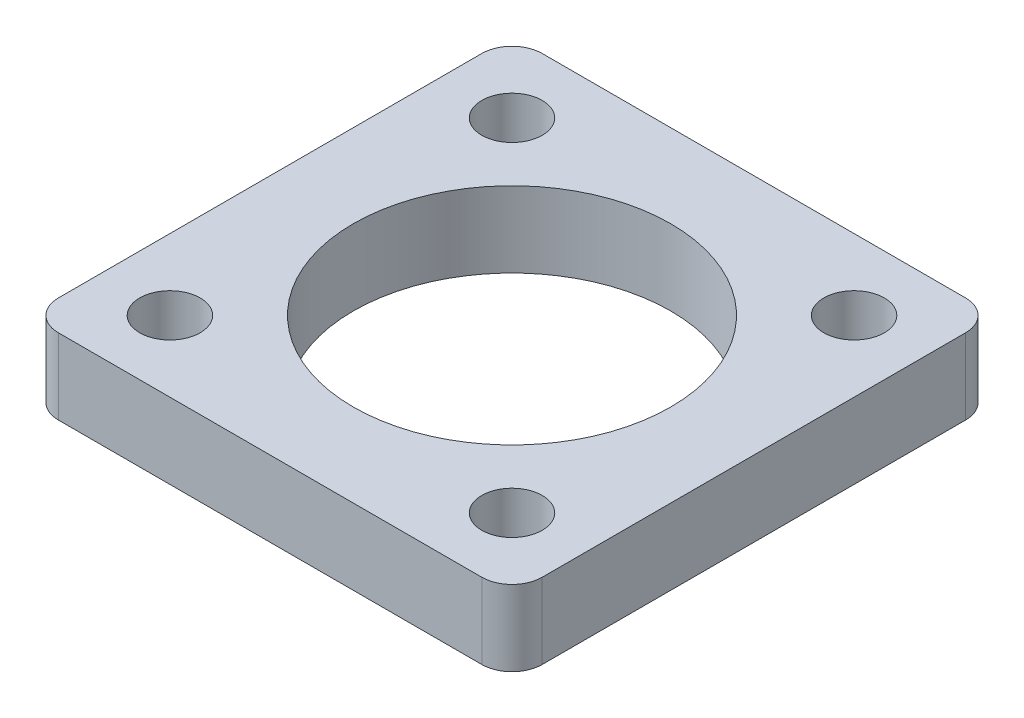
ISO-10303-21;
HEADER;
FILE_DESCRIPTION(('STEP AP214'),'2;1');
FILE_NAME('part.step','',(''),(''),'','','');
FILE_SCHEMA(('AUTOMOTIVE_DESIGN { 1 0 10303 214 1 1 1 1 }'));
ENDSEC;
DATA;
#1=APPLICATION_CONTEXT('core data for automotive mechanical design processes');
#2=APPLICATION_PROTOCOL_DEFINITION('international standard','automotive_design',2000,#1);
#3=PRODUCT_CONTEXT('',#1,'mechanical');
#4=PRODUCT('Part','Part','',(#3));
#5=PRODUCT_RELATED_PRODUCT_CATEGORY('part','',(#4));
#6=PRODUCT_DEFINITION_FORMATION('','',#4);
#7=PRODUCT_DEFINITION_CONTEXT('part definition',#1,'design');
#8=PRODUCT_DEFINITION('design','',#6,#7);
#9=PRODUCT_DEFINITION_SHAPE('','',#8);
#10=(LENGTH_UNIT() NAMED_UNIT(*) SI_UNIT(.MILLI.,.METRE.));
#11=(NAMED_UNIT(*) PLANE_ANGLE_UNIT() SI_UNIT($,.RADIAN.));
#12=(NAMED_UNIT(*) SI_UNIT($,.STERADIAN.) SOLID_ANGLE_UNIT());
#13=UNCERTAINTY_MEASURE_WITH_UNIT(LENGTH_MEASURE(1.E-05),#10,'distance_accuracy_value','');
#14=(GEOMETRIC_REPRESENTATION_CONTEXT(3) GLOBAL_UNCERTAINTY_ASSIGNED_CONTEXT((#13)) GLOBAL_UNIT_ASSIGNED_CONTEXT((#10,
#11,#12)) REPRESENTATION_CONTEXT('',''));
#15=CARTESIAN_POINT('',(0.,0.,0.));
#16=DIRECTION('',(0.,0.,1.));
#17=DIRECTION('',(1.,0.,0.));
#18=AXIS2_PLACEMENT_3D('',#15,#16,#17);
#19=CARTESIAN_POINT('',(0.,5.,0.));
#20=DIRECTION('',(0.,1.,0.));
#21=DIRECTION('',(0.,0.,1.));
#22=AXIS2_PLACEMENT_3D('',#19,#20,#21);
#23=PLANE('',#22);
#24=CARTESIAN_POINT('',(11.3137084989848,5.,11.3137084989848));
#25=DIRECTION('',(0.,1.,0.));
#26=DIRECTION('',(0.,0.,1.));
#27=AXIS2_PLACEMENT_3D('',#24,#25,#26);
#28=CIRCLE('',#27,2.);
#29=CARTESIAN_POINT('',(11.3137084989848,5.,13.3137084989848));
#30=VERTEX_POINT('',#29);
#31=EDGE_CURVE('E195',#30,#30,#28,.T.);
#32=ORIENTED_EDGE('',*,*,#31,.F.);
#33=EDGE_LOOP('',(#32));
#34=FACE_BOUND('',#33,.T.);
#35=CARTESIAN_POINT('',(0.,5.,0.));
#36=DIRECTION('',(0.,1.,0.));
#37=DIRECTION('',(0.,0.,1.));
#38=AXIS2_PLACEMENT_3D('',#35,#36,#37);
#39=CIRCLE('',#38,10.5);
#40=CARTESIAN_POINT('',(0.,5.,10.5));
#41=VERTEX_POINT('',#40);
#42=EDGE_CURVE('E184',#41,#41,#39,.T.);
#43=ORIENTED_EDGE('',*,*,#42,.F.);
#44=EDGE_LOOP('',(#43));
#45=FACE_BOUND('',#44,.T.);
#46=DIRECTION('',(1.,0.,0.));
#47=VECTOR('',#46,1.);
#48=CARTESIAN_POINT('',(-16.,5.,16.));
#49=LINE('',#48,#47);
#50=CARTESIAN_POINT('',(-14.,5.,16.));
#51=VERTEX_POINT('',#50);
#52=CARTESIAN_POINT('',(14.,5.,16.));
#53=VERTEX_POINT('',#52);
#54=EDGE_CURVE('E140',#51,#53,#49,.T.);
#55=ORIENTED_EDGE('',*,*,#54,.T.);
#56=CARTESIAN_POINT('',(14.,5.,14.));
#57=DIRECTION('',(0.,1.,0.));
#58=DIRECTION('',(0.,0.,1.));
#59=AXIS2_PLACEMENT_3D('',#56,#57,#58);
#60=CIRCLE('',#59,2.);
#61=CARTESIAN_POINT('',(16.,5.,14.));
#62=VERTEX_POINT('',#61);
#63=EDGE_CURVE('E158',#53,#62,#60,.T.);
#64=ORIENTED_EDGE('',*,*,#63,.T.);
#65=DIRECTION('',(0.,0.,-1.));
#66=VECTOR('',#65,1.);
#67=CARTESIAN_POINT('',(16.,5.,-16.));
#68=LINE('',#67,#66);
#69=CARTESIAN_POINT('',(16.,5.,-14.));
#70=VERTEX_POINT('',#69);
#71=EDGE_CURVE('E122',#62,#70,#68,.T.);
#72=ORIENTED_EDGE('',*,*,#71,.T.);
#73=CARTESIAN_POINT('',(14.,5.,-14.));
#74=DIRECTION('',(0.,1.,0.));
#75=DIRECTION('',(0.,0.,1.));
#76=AXIS2_PLACEMENT_3D('',#73,#74,#75);
#77=CIRCLE('',#76,2.);
#78=CARTESIAN_POINT('',(14.,5.,-16.));
#79=VERTEX_POINT('',#78);
#80=EDGE_CURVE('E155',#70,#79,#77,.T.);
#81=ORIENTED_EDGE('',*,*,#80,.T.);
#82=DIRECTION('',(-1.,0.,0.));
#83=VECTOR('',#82,1.);
#84=CARTESIAN_POINT('',(-16.,5.,-16.));
#85=LINE('',#84,#83);
#86=CARTESIAN_POINT('',(-14.,5.,-16.));
#87=VERTEX_POINT('',#86);
#88=EDGE_CURVE('E169',#79,#87,#85,.T.);
#89=ORIENTED_EDGE('',*,*,#88,.T.);
#90=CARTESIAN_POINT('',(-14.,5.,-14.));
#91=DIRECTION('',(0.,1.,0.));
#92=DIRECTION('',(0.,0.,1.));
#93=AXIS2_PLACEMENT_3D('',#90,#91,#92);
#94=CIRCLE('',#93,2.);
#95=CARTESIAN_POINT('',(-16.,5.,-14.));
#96=VERTEX_POINT('',#95);
#97=EDGE_CURVE('E58',#87,#96,#94,.T.);
#98=ORIENTED_EDGE('',*,*,#97,.T.);
#99=DIRECTION('',(0.,0.,1.));
#100=VECTOR('',#99,1.);
#101=CARTESIAN_POINT('',(-16.,5.,-16.));
#102=LINE('',#101,#100);
#103=CARTESIAN_POINT('',(-16.,5.,14.));
#104=VERTEX_POINT('',#103);
#105=EDGE_CURVE('E177',#96,#104,#102,.T.);
#106=ORIENTED_EDGE('',*,*,#105,.T.);
#107=CARTESIAN_POINT('',(-14.,5.,14.));
#108=DIRECTION('',(0.,1.,0.));
#109=DIRECTION('',(0.,0.,1.));
#110=AXIS2_PLACEMENT_3D('',#107,#108,#109);
#111=CIRCLE('',#110,2.);
#112=EDGE_CURVE('E153',#104,#51,#111,.T.);
#113=ORIENTED_EDGE('',*,*,#112,.T.);
#114=EDGE_LOOP('',(#55,#64,#72,#81,#89,#98,#106,#113));
#115=FACE_BOUND('',#114,.T.);
#116=CARTESIAN_POINT('',(-11.3137084989848,5.,-11.3137084989848));
#117=DIRECTION('',(0.,1.,0.));
#118=DIRECTION('',(0.,0.,1.));
#119=AXIS2_PLACEMENT_3D('',#116,#117,#118);
#120=CIRCLE('',#119,2.);
#121=CARTESIAN_POINT('',(-11.3137084989848,5.,-9.31370849898476));
#122=VERTEX_POINT('',#121);
#123=EDGE_CURVE('E131',#122,#122,#120,.T.);
#124=ORIENTED_EDGE('',*,*,#123,.F.);
#125=EDGE_LOOP('',(#124));
#126=FACE_BOUND('',#125,.T.);
#127=CARTESIAN_POINT('',(11.3137084989848,5.,-11.3137084989848));
#128=DIRECTION('',(0.,1.,0.));
#129=DIRECTION('',(0.,0.,1.));
#130=AXIS2_PLACEMENT_3D('',#127,#128,#129);
#131=CIRCLE('',#130,2.);
#132=CARTESIAN_POINT('',(11.3137084989848,5.,-9.31370849898476));
#133=VERTEX_POINT('',#132);
#134=EDGE_CURVE('E189',#133,#133,#131,.T.);
#135=ORIENTED_EDGE('',*,*,#134,.F.);
#136=EDGE_LOOP('',(#135));
#137=FACE_BOUND('',#136,.T.);
#138=CARTESIAN_POINT('',(-11.3137084989848,5.,11.3137084989848));
#139=DIRECTION('',(0.,1.,0.));
#140=DIRECTION('',(0.,0.,1.));
#141=AXIS2_PLACEMENT_3D('',#138,#139,#140);
#142=CIRCLE('',#141,2.);
#143=CARTESIAN_POINT('',(-11.3137084989848,5.,13.3137084989848));
#144=VERTEX_POINT('',#143);
#145=EDGE_CURVE('E201',#144,#144,#142,.T.);
#146=ORIENTED_EDGE('',*,*,#145,.F.);
#147=EDGE_LOOP('',(#146));
#148=FACE_BOUND('',#147,.T.);
#149=ADVANCED_FACE('F36',(#34,#45,#115,#126,#137,#148),#23,.T.);
#150=CARTESIAN_POINT('',(0.,0.,0.));
#151=DIRECTION('',(0.,1.,0.));
#152=DIRECTION('',(0.,0.,1.));
#153=AXIS2_PLACEMENT_3D('',#150,#151,#152);
#154=PLANE('',#153);
#155=DIRECTION('',(0.,0.,-1.));
#156=VECTOR('',#155,1.);
#157=CARTESIAN_POINT('',(16.,0.,-16.));
#158=LINE('',#157,#156);
#159=CARTESIAN_POINT('',(16.,0.,14.));
#160=VERTEX_POINT('',#159);
#161=CARTESIAN_POINT('',(16.,0.,-14.));
#162=VERTEX_POINT('',#161);
#163=EDGE_CURVE('E119',#160,#162,#158,.T.);
#164=ORIENTED_EDGE('',*,*,#163,.F.);
#165=CARTESIAN_POINT('',(14.,0.,14.));
#166=DIRECTION('',(0.,1.,0.));
#167=DIRECTION('',(0.,0.,1.));
#168=AXIS2_PLACEMENT_3D('',#165,#166,#167);
#169=CIRCLE('',#168,2.);
#170=CARTESIAN_POINT('',(14.,0.,16.));
#171=VERTEX_POINT('',#170);
#172=EDGE_CURVE('E102',#160,#171,#169,.F.);
#173=ORIENTED_EDGE('',*,*,#172,.T.);
#174=DIRECTION('',(1.,0.,0.));
#175=VECTOR('',#174,1.);
#176=CARTESIAN_POINT('',(-16.,0.,16.));
#177=LINE('',#176,#175);
#178=CARTESIAN_POINT('',(-14.,0.,16.));
#179=VERTEX_POINT('',#178);
#180=EDGE_CURVE('E144',#179,#171,#177,.T.);
#181=ORIENTED_EDGE('',*,*,#180,.F.);
#182=CARTESIAN_POINT('',(-14.,0.,14.));
#183=DIRECTION('',(0.,1.,0.));
#184=DIRECTION('',(0.,0.,1.));
#185=AXIS2_PLACEMENT_3D('',#182,#183,#184);
#186=CIRCLE('',#185,2.);
#187=CARTESIAN_POINT('',(-16.,0.,14.));
#188=VERTEX_POINT('',#187);
#189=EDGE_CURVE('E123',#179,#188,#186,.F.);
#190=ORIENTED_EDGE('',*,*,#189,.T.);
#191=DIRECTION('',(0.,0.,1.));
#192=VECTOR('',#191,1.);
#193=CARTESIAN_POINT('',(-16.,0.,-16.));
#194=LINE('',#193,#192);
#195=CARTESIAN_POINT('',(-16.,0.,-14.));
#196=VERTEX_POINT('',#195);
#197=EDGE_CURVE('E134',#196,#188,#194,.T.);
#198=ORIENTED_EDGE('',*,*,#197,.F.);
#199=CARTESIAN_POINT('',(-14.,0.,-14.));
#200=DIRECTION('',(0.,1.,0.));
#201=DIRECTION('',(0.,0.,1.));
#202=AXIS2_PLACEMENT_3D('',#199,#200,#201);
#203=CIRCLE('',#202,2.);
#204=CARTESIAN_POINT('',(-14.,0.,-16.));
#205=VERTEX_POINT('',#204);
#206=EDGE_CURVE('E113',#196,#205,#203,.F.);
#207=ORIENTED_EDGE('',*,*,#206,.T.);
#208=DIRECTION('',(-1.,0.,0.));
#209=VECTOR('',#208,1.);
#210=CARTESIAN_POINT('',(-16.,0.,-16.));
#211=LINE('',#210,#209);
#212=CARTESIAN_POINT('',(14.,0.,-16.));
#213=VERTEX_POINT('',#212);
#214=EDGE_CURVE('E130',#213,#205,#211,.T.);
#215=ORIENTED_EDGE('',*,*,#214,.F.);
#216=CARTESIAN_POINT('',(14.,0.,-14.));
#217=DIRECTION('',(0.,1.,0.));
#218=DIRECTION('',(0.,0.,1.));
#219=AXIS2_PLACEMENT_3D('',#216,#217,#218);
#220=CIRCLE('',#219,2.);
#221=EDGE_CURVE('E129',#213,#162,#220,.F.);
#222=ORIENTED_EDGE('',*,*,#221,.T.);
#223=EDGE_LOOP('',(#164,#173,#181,#190,#198,#207,#215,#222));
#224=FACE_BOUND('',#223,.T.);
#225=CARTESIAN_POINT('',(-11.3137084989848,0.,-11.3137084989848));
#226=DIRECTION('',(0.,1.,0.));
#227=DIRECTION('',(0.,0.,1.));
#228=AXIS2_PLACEMENT_3D('',#225,#226,#227);
#229=CIRCLE('',#228,2.);
#230=CARTESIAN_POINT('',(-11.3137084989848,0.,-9.31370849898476));
#231=VERTEX_POINT('',#230);
#232=EDGE_CURVE('E137',#231,#231,#229,.T.);
#233=ORIENTED_EDGE('',*,*,#232,.T.);
#234=EDGE_LOOP('',(#233));
#235=FACE_BOUND('',#234,.T.);
#236=CARTESIAN_POINT('',(0.,0.,0.));
#237=DIRECTION('',(0.,1.,0.));
#238=DIRECTION('',(0.,0.,1.));
#239=AXIS2_PLACEMENT_3D('',#236,#237,#238);
#240=CIRCLE('',#239,10.5);
#241=CARTESIAN_POINT('',(0.,0.,10.5));
#242=VERTEX_POINT('',#241);
#243=EDGE_CURVE('E186',#242,#242,#240,.T.);
#244=ORIENTED_EDGE('',*,*,#243,.T.);
#245=EDGE_LOOP('',(#244));
#246=FACE_BOUND('',#245,.T.);
#247=CARTESIAN_POINT('',(11.3137084989848,0.,-11.3137084989848));
#248=DIRECTION('',(0.,1.,0.));
#249=DIRECTION('',(0.,0.,1.));
#250=AXIS2_PLACEMENT_3D('',#247,#248,#249);
#251=CIRCLE('',#250,2.);
#252=CARTESIAN_POINT('',(11.3137084989848,0.,-9.31370849898476));
#253=VERTEX_POINT('',#252);
#254=EDGE_CURVE('E192',#253,#253,#251,.T.);
#255=ORIENTED_EDGE('',*,*,#254,.T.);
#256=EDGE_LOOP('',(#255));
#257=FACE_BOUND('',#256,.T.);
#258=CARTESIAN_POINT('',(11.3137084989848,0.,11.3137084989848));
#259=DIRECTION('',(0.,1.,0.));
#260=DIRECTION('',(0.,0.,1.));
#261=AXIS2_PLACEMENT_3D('',#258,#259,#260);
#262=CIRCLE('',#261,2.);
#263=CARTESIAN_POINT('',(11.3137084989848,0.,13.3137084989848));
#264=VERTEX_POINT('',#263);
#265=EDGE_CURVE('E198',#264,#264,#262,.T.);
#266=ORIENTED_EDGE('',*,*,#265,.T.);
#267=EDGE_LOOP('',(#266));
#268=FACE_BOUND('',#267,.T.);
#269=CARTESIAN_POINT('',(-11.3137084989848,0.,11.3137084989848));
#270=DIRECTION('',(0.,1.,0.));
#271=DIRECTION('',(0.,0.,1.));
#272=AXIS2_PLACEMENT_3D('',#269,#270,#271);
#273=CIRCLE('',#272,2.);
#274=CARTESIAN_POINT('',(-11.3137084989848,0.,13.3137084989848));
#275=VERTEX_POINT('',#274);
#276=EDGE_CURVE('E204',#275,#275,#273,.T.);
#277=ORIENTED_EDGE('',*,*,#276,.T.);
#278=EDGE_LOOP('',(#277));
#279=FACE_BOUND('',#278,.T.);
#280=ADVANCED_FACE('F126',(#224,#235,#246,#257,#268,#279),#154,.F.);
#281=CARTESIAN_POINT('',(16.,5.,-16.));
#282=DIRECTION('',(-1.,0.,0.));
#283=DIRECTION('',(0.,0.,1.));
#284=AXIS2_PLACEMENT_3D('',#281,#282,#283);
#285=PLANE('',#284);
#286=ORIENTED_EDGE('',*,*,#71,.F.);
#287=DIRECTION('',(0.,-1.,0.));
#288=VECTOR('',#287,1.);
#289=CARTESIAN_POINT('',(16.,5.,14.));
#290=LINE('',#289,#288);
#291=EDGE_CURVE('E106',#62,#160,#290,.T.);
#292=ORIENTED_EDGE('',*,*,#291,.T.);
#293=ORIENTED_EDGE('',*,*,#163,.T.);
#294=DIRECTION('',(0.,-1.,0.));
#295=VECTOR('',#294,1.);
#296=CARTESIAN_POINT('',(16.,5.,-14.));
#297=LINE('',#296,#295);
#298=EDGE_CURVE('E124',#162,#70,#297,.F.);
#299=ORIENTED_EDGE('',*,*,#298,.T.);
#300=EDGE_LOOP('',(#286,#292,#293,#299));
#301=FACE_BOUND('',#300,.T.);
#302=ADVANCED_FACE('F118',(#301),#285,.F.);
#303=CARTESIAN_POINT('',(-16.,5.,-16.));
#304=DIRECTION('',(0.,0.,1.));
#305=DIRECTION('',(1.,0.,0.));
#306=AXIS2_PLACEMENT_3D('',#303,#304,#305);
#307=PLANE('',#306);
#308=ORIENTED_EDGE('',*,*,#214,.T.);
#309=DIRECTION('',(0.,-1.,0.));
#310=VECTOR('',#309,1.);
#311=CARTESIAN_POINT('',(-14.,5.,-16.));
#312=LINE('',#311,#310);
#313=EDGE_CURVE('E11',#205,#87,#312,.F.);
#314=ORIENTED_EDGE('',*,*,#313,.T.);
#315=ORIENTED_EDGE('',*,*,#88,.F.);
#316=DIRECTION('',(0.,-1.,0.));
#317=VECTOR('',#316,1.);
#318=CARTESIAN_POINT('',(14.,5.,-16.));
#319=LINE('',#318,#317);
#320=EDGE_CURVE('E44',#79,#213,#319,.T.);
#321=ORIENTED_EDGE('',*,*,#320,.T.);
#322=EDGE_LOOP('',(#308,#314,#315,#321));
#323=FACE_BOUND('',#322,.T.);
#324=ADVANCED_FACE('F167',(#323),#307,.F.);
#325=CARTESIAN_POINT('',(-16.,5.,-16.));
#326=DIRECTION('',(1.,0.,0.));
#327=DIRECTION('',(0.,0.,-1.));
#328=AXIS2_PLACEMENT_3D('',#325,#326,#327);
#329=PLANE('',#328);
#330=ORIENTED_EDGE('',*,*,#105,.F.);
#331=DIRECTION('',(0.,-1.,0.));
#332=VECTOR('',#331,1.);
#333=CARTESIAN_POINT('',(-16.,5.,-14.));
#334=LINE('',#333,#332);
#335=EDGE_CURVE('E161',#96,#196,#334,.T.);
#336=ORIENTED_EDGE('',*,*,#335,.T.);
#337=ORIENTED_EDGE('',*,*,#197,.T.);
#338=DIRECTION('',(0.,-1.,0.));
#339=VECTOR('',#338,1.);
#340=CARTESIAN_POINT('',(-16.,5.,14.));
#341=LINE('',#340,#339);
#342=EDGE_CURVE('E51',#188,#104,#341,.F.);
#343=ORIENTED_EDGE('',*,*,#342,.T.);
#344=EDGE_LOOP('',(#330,#336,#337,#343));
#345=FACE_BOUND('',#344,.T.);
#346=ADVANCED_FACE('F176',(#345),#329,.F.);
#347=CARTESIAN_POINT('',(-16.,5.,16.));
#348=DIRECTION('',(0.,0.,-1.));
#349=DIRECTION('',(-1.,0.,0.));
#350=AXIS2_PLACEMENT_3D('',#347,#348,#349);
#351=PLANE('',#350);
#352=ORIENTED_EDGE('',*,*,#180,.T.);
#353=DIRECTION('',(0.,-1.,0.));
#354=VECTOR('',#353,1.);
#355=CARTESIAN_POINT('',(14.,5.,16.));
#356=LINE('',#355,#354);
#357=EDGE_CURVE('E107',#171,#53,#356,.F.);
#358=ORIENTED_EDGE('',*,*,#357,.T.);
#359=ORIENTED_EDGE('',*,*,#54,.F.);
#360=DIRECTION('',(0.,-1.,0.));
#361=VECTOR('',#360,1.);
#362=CARTESIAN_POINT('',(-14.,5.,16.));
#363=LINE('',#362,#361);
#364=EDGE_CURVE('E112',#51,#179,#363,.T.);
#365=ORIENTED_EDGE('',*,*,#364,.T.);
#366=EDGE_LOOP('',(#352,#358,#359,#365));
#367=FACE_BOUND('',#366,.T.);
#368=ADVANCED_FACE('F226',(#367),#351,.F.);
#369=CARTESIAN_POINT('',(-11.3137084989848,5.,-11.3137084989848));
#370=DIRECTION('',(0.,-1.,0.));
#371=DIRECTION('',(0.,0.,-1.));
#372=AXIS2_PLACEMENT_3D('',#369,#370,#371);
#373=CYLINDRICAL_SURFACE('',#372,2.);
#374=ORIENTED_EDGE('',*,*,#123,.T.);
#375=EDGE_LOOP('',(#374));
#376=FACE_BOUND('',#375,.T.);
#377=ORIENTED_EDGE('',*,*,#232,.F.);
#378=EDGE_LOOP('',(#377));
#379=FACE_BOUND('',#378,.T.);
#380=ADVANCED_FACE('F223',(#376,#379),#373,.F.);
#381=CARTESIAN_POINT('',(0.,5.,0.));
#382=DIRECTION('',(0.,-1.,0.));
#383=DIRECTION('',(0.,0.,-1.));
#384=AXIS2_PLACEMENT_3D('',#381,#382,#383);
#385=CYLINDRICAL_SURFACE('',#384,10.5);
#386=ORIENTED_EDGE('',*,*,#42,.T.);
#387=EDGE_LOOP('',(#386));
#388=FACE_BOUND('',#387,.T.);
#389=ORIENTED_EDGE('',*,*,#243,.F.);
#390=EDGE_LOOP('',(#389));
#391=FACE_BOUND('',#390,.T.);
#392=ADVANCED_FACE('F256',(#388,#391),#385,.F.);
#393=CARTESIAN_POINT('',(11.3137084989848,5.,-11.3137084989848));
#394=DIRECTION('',(0.,-1.,0.));
#395=DIRECTION('',(0.,0.,-1.));
#396=AXIS2_PLACEMENT_3D('',#393,#394,#395);
#397=CYLINDRICAL_SURFACE('',#396,2.);
#398=ORIENTED_EDGE('',*,*,#134,.T.);
#399=EDGE_LOOP('',(#398));
#400=FACE_BOUND('',#399,.T.);
#401=ORIENTED_EDGE('',*,*,#254,.F.);
#402=EDGE_LOOP('',(#401));
#403=FACE_BOUND('',#402,.T.);
#404=ADVANCED_FACE('F252',(#400,#403),#397,.F.);
#405=CARTESIAN_POINT('',(11.3137084989848,5.,11.3137084989848));
#406=DIRECTION('',(0.,-1.,0.));
#407=DIRECTION('',(0.,0.,-1.));
#408=AXIS2_PLACEMENT_3D('',#405,#406,#407);
#409=CYLINDRICAL_SURFACE('',#408,2.);
#410=ORIENTED_EDGE('',*,*,#31,.T.);
#411=EDGE_LOOP('',(#410));
#412=FACE_BOUND('',#411,.T.);
#413=ORIENTED_EDGE('',*,*,#265,.F.);
#414=EDGE_LOOP('',(#413));
#415=FACE_BOUND('',#414,.T.);
#416=ADVANCED_FACE('F255',(#412,#415),#409,.F.);
#417=CARTESIAN_POINT('',(-11.3137084989848,5.,11.3137084989848));
#418=DIRECTION('',(0.,-1.,0.));
#419=DIRECTION('',(0.,0.,-1.));
#420=AXIS2_PLACEMENT_3D('',#417,#418,#419);
#421=CYLINDRICAL_SURFACE('',#420,2.);
#422=ORIENTED_EDGE('',*,*,#145,.T.);
#423=EDGE_LOOP('',(#422));
#424=FACE_BOUND('',#423,.T.);
#425=ORIENTED_EDGE('',*,*,#276,.F.);
#426=EDGE_LOOP('',(#425));
#427=FACE_BOUND('',#426,.T.);
#428=ADVANCED_FACE('F210',(#424,#427),#421,.F.);
#429=CARTESIAN_POINT('',(14.,5.,14.));
#430=DIRECTION('',(0.,-1.,0.));
#431=DIRECTION('',(0.,0.,-1.));
#432=AXIS2_PLACEMENT_3D('',#429,#430,#431);
#433=CYLINDRICAL_SURFACE('',#432,2.);
#434=ORIENTED_EDGE('',*,*,#63,.F.);
#435=ORIENTED_EDGE('',*,*,#357,.F.);
#436=ORIENTED_EDGE('',*,*,#172,.F.);
#437=ORIENTED_EDGE('',*,*,#291,.F.);
#438=EDGE_LOOP('',(#434,#435,#436,#437));
#439=FACE_BOUND('',#438,.T.);
#440=ADVANCED_FACE('F105',(#439),#433,.T.);
#441=CARTESIAN_POINT('',(-14.,5.,-14.));
#442=DIRECTION('',(0.,-1.,0.));
#443=DIRECTION('',(0.,0.,-1.));
#444=AXIS2_PLACEMENT_3D('',#441,#442,#443);
#445=CYLINDRICAL_SURFACE('',#444,2.);
#446=ORIENTED_EDGE('',*,*,#97,.F.);
#447=ORIENTED_EDGE('',*,*,#313,.F.);
#448=ORIENTED_EDGE('',*,*,#206,.F.);
#449=ORIENTED_EDGE('',*,*,#335,.F.);
#450=EDGE_LOOP('',(#446,#447,#448,#449));
#451=FACE_BOUND('',#450,.T.);
#452=ADVANCED_FACE('F175',(#451),#445,.T.);
#453=CARTESIAN_POINT('',(14.,5.,-14.));
#454=DIRECTION('',(0.,-1.,0.));
#455=DIRECTION('',(0.,0.,-1.));
#456=AXIS2_PLACEMENT_3D('',#453,#454,#455);
#457=CYLINDRICAL_SURFACE('',#456,2.);
#458=ORIENTED_EDGE('',*,*,#80,.F.);
#459=ORIENTED_EDGE('',*,*,#298,.F.);
#460=ORIENTED_EDGE('',*,*,#221,.F.);
#461=ORIENTED_EDGE('',*,*,#320,.F.);
#462=EDGE_LOOP('',(#458,#459,#460,#461));
#463=FACE_BOUND('',#462,.T.);
#464=ADVANCED_FACE('F239',(#463),#457,.T.);
#465=CARTESIAN_POINT('',(-14.,5.,14.));
#466=DIRECTION('',(0.,-1.,0.));
#467=DIRECTION('',(0.,0.,-1.));
#468=AXIS2_PLACEMENT_3D('',#465,#466,#467);
#469=CYLINDRICAL_SURFACE('',#468,2.);
#470=ORIENTED_EDGE('',*,*,#112,.F.);
#471=ORIENTED_EDGE('',*,*,#342,.F.);
#472=ORIENTED_EDGE('',*,*,#189,.F.);
#473=ORIENTED_EDGE('',*,*,#364,.F.);
#474=EDGE_LOOP('',(#470,#471,#472,#473));
#475=FACE_BOUND('',#474,.T.);
#476=ADVANCED_FACE('F38',(#475),#469,.T.);
#477=CLOSED_SHELL('',(#149,#280,#302,#324,#346,#368,#380,#392,#404,#416,#428,#440,#452,#464,#476));
#478=MANIFOLD_SOLID_BREP('B2',#477);
#479=ADVANCED_BREP_SHAPE_REPRESENTATION('',(#18,#478),#14);
#480=SHAPE_DEFINITION_REPRESENTATION(#9,#479);
ENDSEC;
END-ISO-10303-21;
